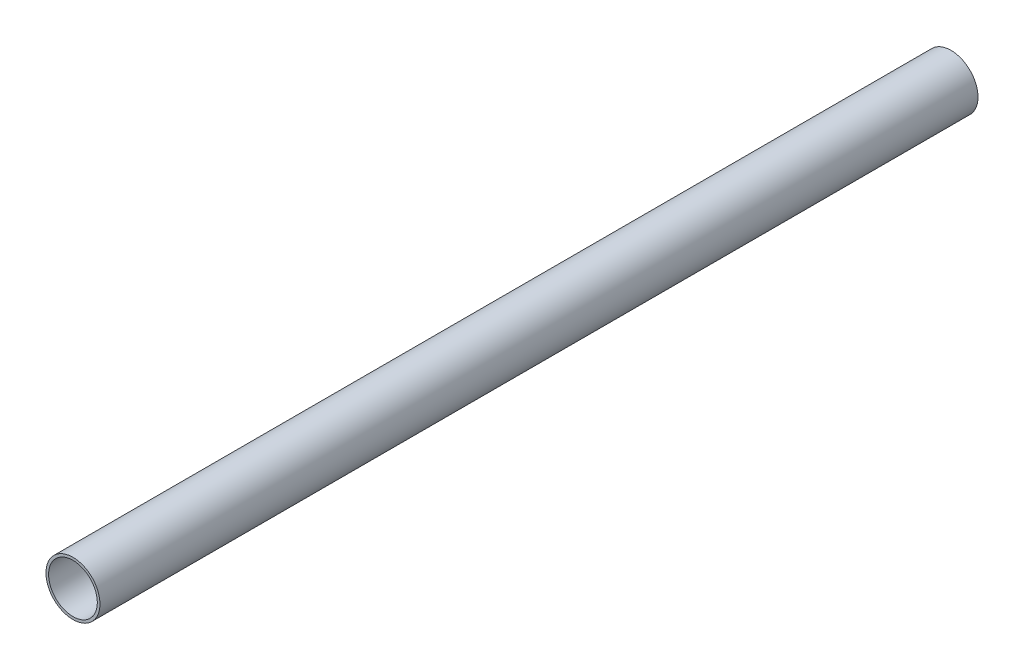
ISO-10303-21;
HEADER;
FILE_DESCRIPTION(('STEP AP214'),'2;1');
FILE_NAME('part.step','',(''),(''),'','','');
FILE_SCHEMA(('AUTOMOTIVE_DESIGN { 1 0 10303 214 1 1 1 1 }'));
ENDSEC;
DATA;
#1=APPLICATION_CONTEXT('core data for automotive mechanical design processes');
#2=APPLICATION_PROTOCOL_DEFINITION('international standard','automotive_design',2000,#1);
#3=PRODUCT_CONTEXT('',#1,'mechanical');
#4=PRODUCT('Part','Part','',(#3));
#5=PRODUCT_RELATED_PRODUCT_CATEGORY('part','',(#4));
#6=PRODUCT_DEFINITION_FORMATION('','',#4);
#7=PRODUCT_DEFINITION_CONTEXT('part definition',#1,'design');
#8=PRODUCT_DEFINITION('design','',#6,#7);
#9=PRODUCT_DEFINITION_SHAPE('','',#8);
#10=(LENGTH_UNIT() NAMED_UNIT(*) SI_UNIT(.MILLI.,.METRE.));
#11=(NAMED_UNIT(*) PLANE_ANGLE_UNIT() SI_UNIT($,.RADIAN.));
#12=(NAMED_UNIT(*) SI_UNIT($,.STERADIAN.) SOLID_ANGLE_UNIT());
#13=UNCERTAINTY_MEASURE_WITH_UNIT(LENGTH_MEASURE(1.E-05),#10,'distance_accuracy_value','');
#14=(GEOMETRIC_REPRESENTATION_CONTEXT(3) GLOBAL_UNCERTAINTY_ASSIGNED_CONTEXT((#13)) GLOBAL_UNIT_ASSIGNED_CONTEXT((#10,
#11,#12)) REPRESENTATION_CONTEXT('',''));
#15=CARTESIAN_POINT('',(0.,0.,0.));
#16=DIRECTION('',(0.,0.,1.));
#17=DIRECTION('',(1.,0.,0.));
#18=AXIS2_PLACEMENT_3D('',#15,#16,#17);
#19=CARTESIAN_POINT('',(0.,0.,13.5));
#20=DIRECTION('',(0.,0.,1.));
#21=DIRECTION('',(1.,0.,0.));
#22=AXIS2_PLACEMENT_3D('',#19,#20,#21);
#23=PLANE('',#22);
#24=CARTESIAN_POINT('',(0.,0.,13.5));
#25=DIRECTION('',(0.,0.,1.));
#26=DIRECTION('',(1.,0.,0.));
#27=AXIS2_PLACEMENT_3D('',#24,#25,#26);
#28=CIRCLE('',#27,0.415);
#29=CARTESIAN_POINT('',(0.415,0.,13.5));
#30=VERTEX_POINT('',#29);
#31=EDGE_CURVE('E10',#30,#30,#28,.T.);
#32=ORIENTED_EDGE('',*,*,#31,.T.);
#33=EDGE_LOOP('',(#32));
#34=FACE_BOUND('',#33,.T.);
#35=CARTESIAN_POINT('',(0.,0.,13.5));
#36=DIRECTION('',(0.,0.,1.));
#37=DIRECTION('',(1.,0.,0.));
#38=AXIS2_PLACEMENT_3D('',#35,#36,#37);
#39=CIRCLE('',#38,0.375);
#40=CARTESIAN_POINT('',(0.375,0.,13.5));
#41=VERTEX_POINT('',#40);
#42=EDGE_CURVE('E48',#41,#41,#39,.T.);
#43=ORIENTED_EDGE('',*,*,#42,.F.);
#44=EDGE_LOOP('',(#43));
#45=FACE_BOUND('',#44,.T.);
#46=ADVANCED_FACE('F37',(#34,#45),#23,.T.);
#47=CARTESIAN_POINT('',(0.,0.,0.));
#48=DIRECTION('',(0.,0.,1.));
#49=DIRECTION('',(1.,0.,0.));
#50=AXIS2_PLACEMENT_3D('',#47,#48,#49);
#51=PLANE('',#50);
#52=CARTESIAN_POINT('',(0.,0.,0.));
#53=DIRECTION('',(0.,0.,1.));
#54=DIRECTION('',(1.,0.,0.));
#55=AXIS2_PLACEMENT_3D('',#52,#53,#54);
#56=CIRCLE('',#55,0.415);
#57=CARTESIAN_POINT('',(0.415,0.,0.));
#58=VERTEX_POINT('',#57);
#59=EDGE_CURVE('E41',#58,#58,#56,.T.);
#60=ORIENTED_EDGE('',*,*,#59,.F.);
#61=EDGE_LOOP('',(#60));
#62=FACE_BOUND('',#61,.T.);
#63=CARTESIAN_POINT('',(0.,0.,0.));
#64=DIRECTION('',(0.,0.,1.));
#65=DIRECTION('',(1.,0.,0.));
#66=AXIS2_PLACEMENT_3D('',#63,#64,#65);
#67=CIRCLE('',#66,0.375);
#68=CARTESIAN_POINT('',(0.375,0.,0.));
#69=VERTEX_POINT('',#68);
#70=EDGE_CURVE('E50',#69,#69,#67,.T.);
#71=ORIENTED_EDGE('',*,*,#70,.T.);
#72=EDGE_LOOP('',(#71));
#73=FACE_BOUND('',#72,.T.);
#74=ADVANCED_FACE('F60',(#62,#73),#51,.F.);
#75=CARTESIAN_POINT('',(0.,0.,13.5));
#76=DIRECTION('',(0.,0.,-1.));
#77=DIRECTION('',(-1.,0.,0.));
#78=AXIS2_PLACEMENT_3D('',#75,#76,#77);
#79=CYLINDRICAL_SURFACE('',#78,0.415);
#80=ORIENTED_EDGE('',*,*,#31,.F.);
#81=EDGE_LOOP('',(#80));
#82=FACE_BOUND('',#81,.T.);
#83=ORIENTED_EDGE('',*,*,#59,.T.);
#84=EDGE_LOOP('',(#83));
#85=FACE_BOUND('',#84,.T.);
#86=ADVANCED_FACE('F39',(#82,#85),#79,.T.);
#87=CARTESIAN_POINT('',(0.,0.,13.5));
#88=DIRECTION('',(0.,0.,-1.));
#89=DIRECTION('',(-1.,0.,0.));
#90=AXIS2_PLACEMENT_3D('',#87,#88,#89);
#91=CYLINDRICAL_SURFACE('',#90,0.375);
#92=ORIENTED_EDGE('',*,*,#42,.T.);
#93=EDGE_LOOP('',(#92));
#94=FACE_BOUND('',#93,.T.);
#95=ORIENTED_EDGE('',*,*,#70,.F.);
#96=EDGE_LOOP('',(#95));
#97=FACE_BOUND('',#96,.T.);
#98=ADVANCED_FACE('F56',(#94,#97),#91,.F.);
#99=CLOSED_SHELL('',(#46,#74,#86,#98));
#100=MANIFOLD_SOLID_BREP('B2',#99);
#101=ADVANCED_BREP_SHAPE_REPRESENTATION('',(#18,#100),#14);
#102=SHAPE_DEFINITION_REPRESENTATION(#9,#101);
ENDSEC;
END-ISO-10303-21;
